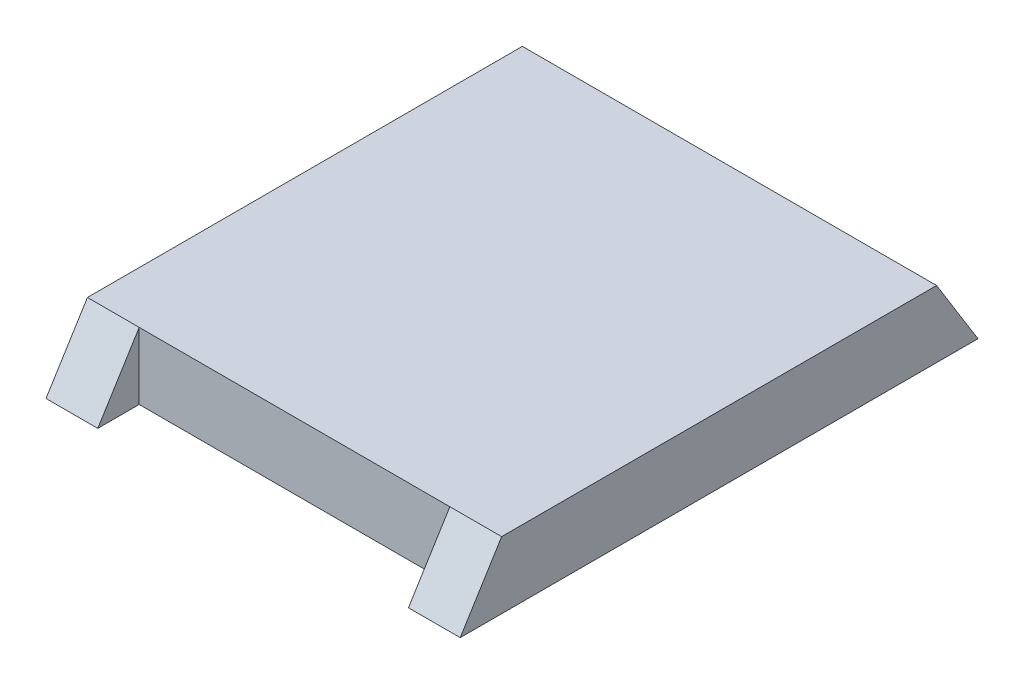
ISO-10303-21;
HEADER;
FILE_DESCRIPTION(('STEP AP214'),'2;1');
FILE_NAME('part.step','',(''),(''),'','','');
FILE_SCHEMA(('AUTOMOTIVE_DESIGN { 1 0 10303 214 1 1 1 1 }'));
ENDSEC;
DATA;
#1=APPLICATION_CONTEXT('core data for automotive mechanical design processes');
#2=APPLICATION_PROTOCOL_DEFINITION('international standard','automotive_design',2000,#1);
#3=PRODUCT_CONTEXT('',#1,'mechanical');
#4=PRODUCT('Part','Part','',(#3));
#5=PRODUCT_RELATED_PRODUCT_CATEGORY('part','',(#4));
#6=PRODUCT_DEFINITION_FORMATION('','',#4);
#7=PRODUCT_DEFINITION_CONTEXT('part definition',#1,'design');
#8=PRODUCT_DEFINITION('design','',#6,#7);
#9=PRODUCT_DEFINITION_SHAPE('','',#8);
#10=(LENGTH_UNIT() NAMED_UNIT(*) SI_UNIT(.MILLI.,.METRE.));
#11=(NAMED_UNIT(*) PLANE_ANGLE_UNIT() SI_UNIT($,.RADIAN.));
#12=(NAMED_UNIT(*) SI_UNIT($,.STERADIAN.) SOLID_ANGLE_UNIT());
#13=UNCERTAINTY_MEASURE_WITH_UNIT(LENGTH_MEASURE(1.E-05),#10,'distance_accuracy_value','');
#14=(GEOMETRIC_REPRESENTATION_CONTEXT(3) GLOBAL_UNCERTAINTY_ASSIGNED_CONTEXT((#13)) GLOBAL_UNIT_ASSIGNED_CONTEXT((#10,
#11,#12)) REPRESENTATION_CONTEXT('',''));
#15=CARTESIAN_POINT('',(0.,0.,0.));
#16=DIRECTION('',(0.,0.,1.));
#17=DIRECTION('',(1.,0.,0.));
#18=AXIS2_PLACEMENT_3D('',#15,#16,#17);
#19=CARTESIAN_POINT('',(-300.,-15.9345808434763,186.292988389895));
#20=DIRECTION('',(-1.,0.,0.));
#21=DIRECTION('',(0.,0.,1.));
#22=AXIS2_PLACEMENT_3D('',#19,#20,#21);
#23=PLANE('',#22);
#24=DIRECTION('',(0.,1.,0.));
#25=VECTOR('',#24,1.);
#26=CARTESIAN_POINT('',(-300.,129.,420.));
#27=LINE('',#26,#25);
#28=CARTESIAN_POINT('',(-300.,0.,420.));
#29=VERTEX_POINT('',#28);
#30=CARTESIAN_POINT('',(-300.,129.,420.));
#31=VERTEX_POINT('',#30);
#32=EDGE_CURVE('E153',#29,#31,#27,.T.);
#33=ORIENTED_EDGE('',*,*,#32,.T.);
#34=DIRECTION('',(0.,-0.849843678582201,0.527034839430822));
#35=VECTOR('',#34,1.);
#36=CARTESIAN_POINT('',(-300.,129.,420.));
#37=LINE('',#36,#35);
#38=CARTESIAN_POINT('',(-300.,-1.11022302462516E-13,500.));
#39=VERTEX_POINT('',#38);
#40=EDGE_CURVE('E147',#31,#39,#37,.T.);
#41=ORIENTED_EDGE('',*,*,#40,.T.);
#42=DIRECTION('',(0.,0.,1.));
#43=VECTOR('',#42,1.);
#44=CARTESIAN_POINT('',(-300.,0.,0.));
#45=LINE('',#44,#43);
#46=EDGE_CURVE('E57',#29,#39,#45,.T.);
#47=ORIENTED_EDGE('',*,*,#46,.F.);
#48=EDGE_LOOP('',(#33,#41,#47));
#49=FACE_BOUND('',#48,.T.);
#50=ADVANCED_FACE('F39',(#49),#23,.F.);
#51=CARTESIAN_POINT('',(300.,-15.9345808434763,186.292988389895));
#52=DIRECTION('',(1.,0.,0.));
#53=DIRECTION('',(0.,0.,-1.));
#54=AXIS2_PLACEMENT_3D('',#51,#52,#53);
#55=PLANE('',#54);
#56=DIRECTION('',(0.,1.,0.));
#57=VECTOR('',#56,1.);
#58=CARTESIAN_POINT('',(300.,129.,420.));
#59=LINE('',#58,#57);
#60=CARTESIAN_POINT('',(300.,0.,420.));
#61=VERTEX_POINT('',#60);
#62=CARTESIAN_POINT('',(300.,129.,420.));
#63=VERTEX_POINT('',#62);
#64=EDGE_CURVE('E65',#61,#63,#59,.T.);
#65=ORIENTED_EDGE('',*,*,#64,.F.);
#66=DIRECTION('',(0.,0.,-1.));
#67=VECTOR('',#66,1.);
#68=CARTESIAN_POINT('',(300.,0.,0.));
#69=LINE('',#68,#67);
#70=CARTESIAN_POINT('',(300.,0.,500.));
#71=VERTEX_POINT('',#70);
#72=EDGE_CURVE('E143',#71,#61,#69,.T.);
#73=ORIENTED_EDGE('',*,*,#72,.F.);
#74=DIRECTION('',(0.,0.849843678582201,-0.527034839430822));
#75=VECTOR('',#74,1.);
#76=CARTESIAN_POINT('',(300.,129.,420.));
#77=LINE('',#76,#75);
#78=EDGE_CURVE('E123',#71,#63,#77,.T.);
#79=ORIENTED_EDGE('',*,*,#78,.T.);
#80=EDGE_LOOP('',(#65,#73,#79));
#81=FACE_BOUND('',#80,.T.);
#82=ADVANCED_FACE('F145',(#81),#55,.F.);
#83=CARTESIAN_POINT('',(0.,129.,0.));
#84=DIRECTION('',(0.,1.,0.));
#85=DIRECTION('',(0.,0.,1.));
#86=AXIS2_PLACEMENT_3D('',#83,#84,#85);
#87=PLANE('',#86);
#88=DIRECTION('',(-1.,0.,0.));
#89=VECTOR('',#88,1.);
#90=CARTESIAN_POINT('',(400.,129.,-420.));
#91=LINE('',#90,#89);
#92=CARTESIAN_POINT('',(400.,129.,-420.));
#93=VERTEX_POINT('',#92);
#94=CARTESIAN_POINT('',(300.,129.,-420.));
#95=VERTEX_POINT('',#94);
#96=EDGE_CURVE('E165',#93,#95,#91,.T.);
#97=ORIENTED_EDGE('',*,*,#96,.T.);
#98=DIRECTION('',(1.,0.,0.));
#99=VECTOR('',#98,1.);
#100=CARTESIAN_POINT('',(0.,129.,-420.));
#101=LINE('',#100,#99);
#102=CARTESIAN_POINT('',(-300.,129.,-420.));
#103=VERTEX_POINT('',#102);
#104=EDGE_CURVE('E183',#103,#95,#101,.T.);
#105=ORIENTED_EDGE('',*,*,#104,.F.);
#106=DIRECTION('',(1.,0.,0.));
#107=VECTOR('',#106,1.);
#108=CARTESIAN_POINT('',(-400.,129.,-420.));
#109=LINE('',#108,#107);
#110=CARTESIAN_POINT('',(-400.,129.,-420.));
#111=VERTEX_POINT('',#110);
#112=EDGE_CURVE('E175',#111,#103,#109,.T.);
#113=ORIENTED_EDGE('',*,*,#112,.F.);
#114=DIRECTION('',(0.,0.,-1.));
#115=VECTOR('',#114,1.);
#116=CARTESIAN_POINT('',(-400.,129.,500.));
#117=LINE('',#116,#115);
#118=CARTESIAN_POINT('',(-400.,129.,420.));
#119=VERTEX_POINT('',#118);
#120=EDGE_CURVE('E11',#119,#111,#117,.T.);
#121=ORIENTED_EDGE('',*,*,#120,.F.);
#122=DIRECTION('',(-1.,0.,0.));
#123=VECTOR('',#122,1.);
#124=CARTESIAN_POINT('',(400.,129.,420.));
#125=LINE('',#124,#123);
#126=EDGE_CURVE('E132',#31,#119,#125,.T.);
#127=ORIENTED_EDGE('',*,*,#126,.F.);
#128=DIRECTION('',(-1.,0.,0.));
#129=VECTOR('',#128,1.);
#130=CARTESIAN_POINT('',(-300.,129.,420.));
#131=LINE('',#130,#129);
#132=EDGE_CURVE('E136',#63,#31,#131,.T.);
#133=ORIENTED_EDGE('',*,*,#132,.F.);
#134=CARTESIAN_POINT('',(400.,129.,420.));
#135=VERTEX_POINT('',#134);
#136=EDGE_CURVE('E120',#135,#63,#125,.T.);
#137=ORIENTED_EDGE('',*,*,#136,.F.);
#138=DIRECTION('',(0.,0.,-1.));
#139=VECTOR('',#138,1.);
#140=CARTESIAN_POINT('',(400.,129.,500.));
#141=LINE('',#140,#139);
#142=EDGE_CURVE('E49',#135,#93,#141,.T.);
#143=ORIENTED_EDGE('',*,*,#142,.T.);
#144=EDGE_LOOP('',(#97,#105,#113,#121,#127,#133,#137,#143));
#145=FACE_BOUND('',#144,.T.);
#146=ADVANCED_FACE('F138',(#145),#87,.T.);
#147=CARTESIAN_POINT('',(0.,0.,0.));
#148=DIRECTION('',(0.,1.,0.));
#149=DIRECTION('',(0.,0.,1.));
#150=AXIS2_PLACEMENT_3D('',#147,#148,#149);
#151=PLANE('',#150);
#152=DIRECTION('',(1.,0.,0.));
#153=VECTOR('',#152,1.);
#154=CARTESIAN_POINT('',(-300.,0.,420.));
#155=LINE('',#154,#153);
#156=EDGE_CURVE('E151',#29,#61,#155,.T.);
#157=ORIENTED_EDGE('',*,*,#156,.F.);
#158=ORIENTED_EDGE('',*,*,#46,.T.);
#159=DIRECTION('',(1.,0.,0.));
#160=VECTOR('',#159,1.);
#161=CARTESIAN_POINT('',(-400.,0.,500.));
#162=LINE('',#161,#160);
#163=CARTESIAN_POINT('',(-400.,0.,500.));
#164=VERTEX_POINT('',#163);
#165=EDGE_CURVE('E225',#164,#39,#162,.T.);
#166=ORIENTED_EDGE('',*,*,#165,.F.);
#167=DIRECTION('',(0.,0.,-1.));
#168=VECTOR('',#167,1.);
#169=CARTESIAN_POINT('',(-400.,0.,500.));
#170=LINE('',#169,#168);
#171=CARTESIAN_POINT('',(-400.,0.,-500.));
#172=VERTEX_POINT('',#171);
#173=EDGE_CURVE('E43',#164,#172,#170,.T.);
#174=ORIENTED_EDGE('',*,*,#173,.T.);
#175=DIRECTION('',(1.,0.,0.));
#176=VECTOR('',#175,1.);
#177=CARTESIAN_POINT('',(-400.,0.,-500.));
#178=LINE('',#177,#176);
#179=CARTESIAN_POINT('',(-300.,0.,-500.));
#180=VERTEX_POINT('',#179);
#181=EDGE_CURVE('E217',#172,#180,#178,.T.);
#182=ORIENTED_EDGE('',*,*,#181,.T.);
#183=DIRECTION('',(0.,0.,-1.));
#184=VECTOR('',#183,1.);
#185=CARTESIAN_POINT('',(-300.,0.,-420.));
#186=LINE('',#185,#184);
#187=CARTESIAN_POINT('',(-300.,0.,-420.));
#188=VERTEX_POINT('',#187);
#189=EDGE_CURVE('E196',#188,#180,#186,.T.);
#190=ORIENTED_EDGE('',*,*,#189,.F.);
#191=DIRECTION('',(-1.,0.,0.));
#192=VECTOR('',#191,1.);
#193=CARTESIAN_POINT('',(0.,0.,-420.));
#194=LINE('',#193,#192);
#195=CARTESIAN_POINT('',(300.,0.,-420.));
#196=VERTEX_POINT('',#195);
#197=EDGE_CURVE('E191',#196,#188,#194,.T.);
#198=ORIENTED_EDGE('',*,*,#197,.F.);
#199=DIRECTION('',(0.,0.,-1.));
#200=VECTOR('',#199,1.);
#201=CARTESIAN_POINT('',(300.,0.,-420.));
#202=LINE('',#201,#200);
#203=CARTESIAN_POINT('',(300.,0.,-500.));
#204=VERTEX_POINT('',#203);
#205=EDGE_CURVE('E195',#196,#204,#202,.T.);
#206=ORIENTED_EDGE('',*,*,#205,.T.);
#207=CARTESIAN_POINT('',(400.,0.,-500.));
#208=VERTEX_POINT('',#207);
#209=EDGE_CURVE('E131',#204,#208,#178,.T.);
#210=ORIENTED_EDGE('',*,*,#209,.T.);
#211=DIRECTION('',(0.,0.,-1.));
#212=VECTOR('',#211,1.);
#213=CARTESIAN_POINT('',(400.,0.,500.));
#214=LINE('',#213,#212);
#215=CARTESIAN_POINT('',(400.,0.,500.));
#216=VERTEX_POINT('',#215);
#217=EDGE_CURVE('E221',#216,#208,#214,.T.);
#218=ORIENTED_EDGE('',*,*,#217,.F.);
#219=EDGE_CURVE('E224',#71,#216,#162,.T.);
#220=ORIENTED_EDGE('',*,*,#219,.F.);
#221=ORIENTED_EDGE('',*,*,#72,.T.);
#222=EDGE_LOOP('',(#157,#158,#166,#174,#182,#190,#198,#206,#210,#218,#220,#221));
#223=FACE_BOUND('',#222,.T.);
#224=ADVANCED_FACE('F238',(#223),#151,.F.);
#225=CARTESIAN_POINT('',(400.,223.948613341435,361.117139013063));
#226=DIRECTION('',(0.,0.527034839430822,0.849843678582201));
#227=DIRECTION('',(0.,-0.849843678582201,0.527034839430822));
#228=AXIS2_PLACEMENT_3D('',#225,#226,#227);
#229=PLANE('',#228);
#230=ORIENTED_EDGE('',*,*,#40,.F.);
#231=ORIENTED_EDGE('',*,*,#126,.T.);
#232=DIRECTION('',(0.,0.849843678582201,-0.527034839430822));
#233=VECTOR('',#232,1.);
#234=CARTESIAN_POINT('',(-400.,223.948613341435,361.117139013063));
#235=LINE('',#234,#233);
#236=EDGE_CURVE('E209',#164,#119,#235,.T.);
#237=ORIENTED_EDGE('',*,*,#236,.F.);
#238=ORIENTED_EDGE('',*,*,#165,.T.);
#239=EDGE_LOOP('',(#230,#231,#237,#238));
#240=FACE_BOUND('',#239,.T.);
#241=ADVANCED_FACE('F245',(#240),#229,.T.);
#242=CARTESIAN_POINT('',(-400.,129.,500.));
#243=DIRECTION('',(-1.,0.,0.));
#244=DIRECTION('',(0.,0.,1.));
#245=AXIS2_PLACEMENT_3D('',#242,#243,#244);
#246=PLANE('',#245);
#247=DIRECTION('',(0.,-0.849843678582201,-0.527034839430822));
#248=VECTOR('',#247,1.);
#249=CARTESIAN_POINT('',(-400.,0.,-500.));
#250=LINE('',#249,#248);
#251=EDGE_CURVE('E171',#111,#172,#250,.T.);
#252=ORIENTED_EDGE('',*,*,#251,.T.);
#253=ORIENTED_EDGE('',*,*,#173,.F.);
#254=ORIENTED_EDGE('',*,*,#236,.T.);
#255=ORIENTED_EDGE('',*,*,#120,.T.);
#256=EDGE_LOOP('',(#252,#253,#254,#255));
#257=FACE_BOUND('',#256,.T.);
#258=ADVANCED_FACE('F248',(#257),#246,.T.);
#259=CARTESIAN_POINT('',(400.,129.,500.));
#260=DIRECTION('',(-1.,0.,0.));
#261=DIRECTION('',(0.,0.,1.));
#262=AXIS2_PLACEMENT_3D('',#259,#260,#261);
#263=PLANE('',#262);
#264=ORIENTED_EDGE('',*,*,#217,.T.);
#265=DIRECTION('',(0.,0.849843678582201,0.527034839430822));
#266=VECTOR('',#265,1.);
#267=CARTESIAN_POINT('',(400.,0.,-500.));
#268=LINE('',#267,#266);
#269=EDGE_CURVE('E161',#208,#93,#268,.T.);
#270=ORIENTED_EDGE('',*,*,#269,.T.);
#271=ORIENTED_EDGE('',*,*,#142,.F.);
#272=DIRECTION('',(0.,0.849843678582201,-0.527034839430822));
#273=VECTOR('',#272,1.);
#274=CARTESIAN_POINT('',(400.,223.948613341435,361.117139013063));
#275=LINE('',#274,#273);
#276=EDGE_CURVE('E126',#216,#135,#275,.T.);
#277=ORIENTED_EDGE('',*,*,#276,.F.);
#278=EDGE_LOOP('',(#264,#270,#271,#277));
#279=FACE_BOUND('',#278,.T.);
#280=ADVANCED_FACE('F41',(#279),#263,.F.);
#281=ORIENTED_EDGE('',*,*,#78,.F.);
#282=ORIENTED_EDGE('',*,*,#219,.T.);
#283=ORIENTED_EDGE('',*,*,#276,.T.);
#284=ORIENTED_EDGE('',*,*,#136,.T.);
#285=EDGE_LOOP('',(#281,#282,#283,#284));
#286=FACE_BOUND('',#285,.T.);
#287=ADVANCED_FACE('F122',(#286),#229,.T.);
#288=CARTESIAN_POINT('',(-300.,0.,-420.));
#289=DIRECTION('',(1.,0.,0.));
#290=DIRECTION('',(0.,0.,-1.));
#291=AXIS2_PLACEMENT_3D('',#288,#289,#290);
#292=PLANE('',#291);
#293=DIRECTION('',(0.,-0.849843678582201,-0.527034839430822));
#294=VECTOR('',#293,1.);
#295=CARTESIAN_POINT('',(-300.,0.,-500.));
#296=LINE('',#295,#294);
#297=EDGE_CURVE('E170',#103,#180,#296,.T.);
#298=ORIENTED_EDGE('',*,*,#297,.F.);
#299=DIRECTION('',(0.,-1.,0.));
#300=VECTOR('',#299,1.);
#301=CARTESIAN_POINT('',(-300.,0.,-420.));
#302=LINE('',#301,#300);
#303=EDGE_CURVE('E180',#103,#188,#302,.T.);
#304=ORIENTED_EDGE('',*,*,#303,.T.);
#305=ORIENTED_EDGE('',*,*,#189,.T.);
#306=EDGE_LOOP('',(#298,#304,#305));
#307=FACE_BOUND('',#306,.T.);
#308=ADVANCED_FACE('F256',(#307),#292,.T.);
#309=CARTESIAN_POINT('',(300.,1.29095700537809E-13,-420.));
#310=DIRECTION('',(-1.,0.,0.));
#311=DIRECTION('',(0.,-1.,0.));
#312=AXIS2_PLACEMENT_3D('',#309,#310,#311);
#313=PLANE('',#312);
#314=DIRECTION('',(0.,0.849843678582201,0.527034839430822));
#315=VECTOR('',#314,1.);
#316=CARTESIAN_POINT('',(300.,0.,-500.));
#317=LINE('',#316,#315);
#318=EDGE_CURVE('E160',#204,#95,#317,.T.);
#319=ORIENTED_EDGE('',*,*,#318,.F.);
#320=ORIENTED_EDGE('',*,*,#205,.F.);
#321=DIRECTION('',(0.,1.,0.));
#322=VECTOR('',#321,1.);
#323=CARTESIAN_POINT('',(300.,1.29095700537809E-13,-420.));
#324=LINE('',#323,#322);
#325=EDGE_CURVE('E187',#196,#95,#324,.T.);
#326=ORIENTED_EDGE('',*,*,#325,.T.);
#327=EDGE_LOOP('',(#319,#320,#326));
#328=FACE_BOUND('',#327,.T.);
#329=ADVANCED_FACE('F318',(#328),#313,.T.);
#330=CARTESIAN_POINT('',(0.,0.,-420.));
#331=DIRECTION('',(0.,0.,-1.));
#332=DIRECTION('',(-1.,0.,0.));
#333=AXIS2_PLACEMENT_3D('',#330,#331,#332);
#334=PLANE('',#333);
#335=ORIENTED_EDGE('',*,*,#303,.F.);
#336=ORIENTED_EDGE('',*,*,#104,.T.);
#337=ORIENTED_EDGE('',*,*,#325,.F.);
#338=ORIENTED_EDGE('',*,*,#197,.T.);
#339=EDGE_LOOP('',(#335,#336,#337,#338));
#340=FACE_BOUND('',#339,.T.);
#341=ADVANCED_FACE('F259',(#340),#334,.T.);
#342=CARTESIAN_POINT('',(-400.,0.,-500.));
#343=DIRECTION('',(0.,-0.527034839430822,0.849843678582201));
#344=DIRECTION('',(0.,-0.849843678582201,-0.527034839430822));
#345=AXIS2_PLACEMENT_3D('',#342,#343,#344);
#346=PLANE('',#345);
#347=ORIENTED_EDGE('',*,*,#297,.T.);
#348=ORIENTED_EDGE('',*,*,#181,.F.);
#349=ORIENTED_EDGE('',*,*,#251,.F.);
#350=ORIENTED_EDGE('',*,*,#112,.T.);
#351=EDGE_LOOP('',(#347,#348,#349,#350));
#352=FACE_BOUND('',#351,.T.);
#353=ADVANCED_FACE('F253',(#352),#346,.F.);
#354=CARTESIAN_POINT('',(400.,0.,-500.));
#355=DIRECTION('',(0.,-0.527034839430822,0.849843678582201));
#356=DIRECTION('',(0.,-0.849843678582201,-0.527034839430822));
#357=AXIS2_PLACEMENT_3D('',#354,#355,#356);
#358=PLANE('',#357);
#359=ORIENTED_EDGE('',*,*,#318,.T.);
#360=ORIENTED_EDGE('',*,*,#96,.F.);
#361=ORIENTED_EDGE('',*,*,#269,.F.);
#362=ORIENTED_EDGE('',*,*,#209,.F.);
#363=EDGE_LOOP('',(#359,#360,#361,#362));
#364=FACE_BOUND('',#363,.T.);
#365=ADVANCED_FACE('F303',(#364),#358,.F.);
#366=CARTESIAN_POINT('',(-300.,129.,420.));
#367=DIRECTION('',(0.,0.,-1.));
#368=DIRECTION('',(-1.,0.,0.));
#369=AXIS2_PLACEMENT_3D('',#366,#367,#368);
#370=PLANE('',#369);
#371=ORIENTED_EDGE('',*,*,#64,.T.);
#372=ORIENTED_EDGE('',*,*,#132,.T.);
#373=ORIENTED_EDGE('',*,*,#32,.F.);
#374=ORIENTED_EDGE('',*,*,#156,.T.);
#375=EDGE_LOOP('',(#371,#372,#373,#374));
#376=FACE_BOUND('',#375,.T.);
#377=ADVANCED_FACE('F150',(#376),#370,.F.);
#378=CLOSED_SHELL('',(#50,#82,#146,#224,#241,#258,#280,#287,#308,#329,#341,#353,#365,#377));
#379=MANIFOLD_SOLID_BREP('B2',#378);
#380=ADVANCED_BREP_SHAPE_REPRESENTATION('',(#18,#379),#14);
#381=SHAPE_DEFINITION_REPRESENTATION(#9,#380);
ENDSEC;
END-ISO-10303-21;
